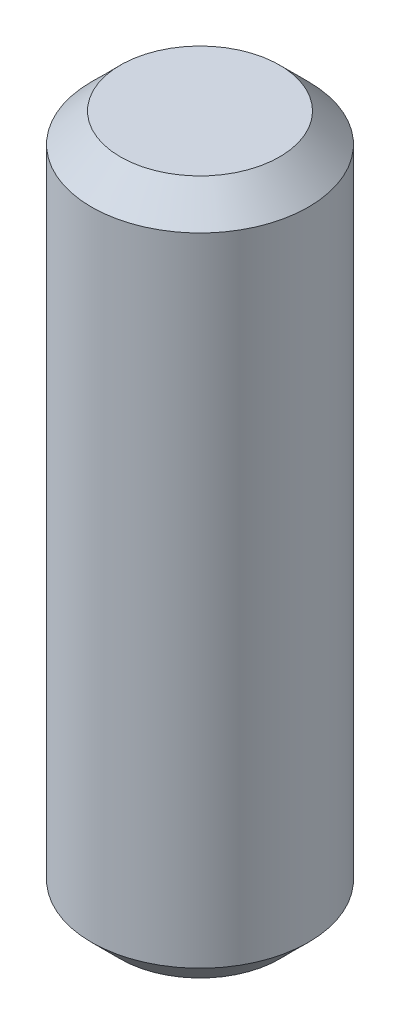
ISO-10303-21;
HEADER;
FILE_DESCRIPTION(('STEP AP214'),'2;1');
FILE_NAME('part.step','',(''),(''),'','','');
FILE_SCHEMA(('AUTOMOTIVE_DESIGN { 1 0 10303 214 1 1 1 1 }'));
ENDSEC;
DATA;
#1=APPLICATION_CONTEXT('core data for automotive mechanical design processes');
#2=APPLICATION_PROTOCOL_DEFINITION('international standard','automotive_design',2000,#1);
#3=PRODUCT_CONTEXT('',#1,'mechanical');
#4=PRODUCT('Part','Part','',(#3));
#5=PRODUCT_RELATED_PRODUCT_CATEGORY('part','',(#4));
#6=PRODUCT_DEFINITION_FORMATION('','',#4);
#7=PRODUCT_DEFINITION_CONTEXT('part definition',#1,'design');
#8=PRODUCT_DEFINITION('design','',#6,#7);
#9=PRODUCT_DEFINITION_SHAPE('','',#8);
#10=(LENGTH_UNIT() NAMED_UNIT(*) SI_UNIT(.MILLI.,.METRE.));
#11=(NAMED_UNIT(*) PLANE_ANGLE_UNIT() SI_UNIT($,.RADIAN.));
#12=(NAMED_UNIT(*) SI_UNIT($,.STERADIAN.) SOLID_ANGLE_UNIT());
#13=UNCERTAINTY_MEASURE_WITH_UNIT(LENGTH_MEASURE(1.E-05),#10,'distance_accuracy_value','');
#14=(GEOMETRIC_REPRESENTATION_CONTEXT(3) GLOBAL_UNCERTAINTY_ASSIGNED_CONTEXT((#13)) GLOBAL_UNIT_ASSIGNED_CONTEXT((#10,
#11,#12)) REPRESENTATION_CONTEXT('',''));
#15=CARTESIAN_POINT('',(0.,0.,0.));
#16=DIRECTION('',(0.,0.,1.));
#17=DIRECTION('',(1.,0.,0.));
#18=AXIS2_PLACEMENT_3D('',#15,#16,#17);
#19=CARTESIAN_POINT('',(0.,48.,0.));
#20=DIRECTION('',(0.,-1.,0.));
#21=DIRECTION('',(0.,0.,-1.));
#22=AXIS2_PLACEMENT_3D('',#19,#20,#21);
#23=CYLINDRICAL_SURFACE('',#22,7.5);
#24=CARTESIAN_POINT('',(0.,2.,0.));
#25=DIRECTION('',(0.,1.,0.));
#26=DIRECTION('',(0.,0.,1.));
#27=AXIS2_PLACEMENT_3D('',#24,#25,#26);
#28=CIRCLE('',#27,7.5);
#29=CARTESIAN_POINT('',(0.,2.,7.5));
#30=VERTEX_POINT('',#29);
#31=EDGE_CURVE('E53',#30,#30,#28,.T.);
#32=ORIENTED_EDGE('',*,*,#31,.T.);
#33=EDGE_LOOP('',(#32));
#34=FACE_BOUND('',#33,.T.);
#35=CARTESIAN_POINT('',(0.,46.,0.));
#36=DIRECTION('',(0.,1.,0.));
#37=DIRECTION('',(0.,0.,1.));
#38=AXIS2_PLACEMENT_3D('',#35,#36,#37);
#39=CIRCLE('',#38,7.5);
#40=CARTESIAN_POINT('',(0.,46.,7.5));
#41=VERTEX_POINT('',#40);
#42=EDGE_CURVE('E57',#41,#41,#39,.F.);
#43=ORIENTED_EDGE('',*,*,#42,.T.);
#44=EDGE_LOOP('',(#43));
#45=FACE_BOUND('',#44,.T.);
#46=ADVANCED_FACE('F41',(#34,#45),#23,.T.);
#47=CARTESIAN_POINT('',(0.,48.,0.));
#48=DIRECTION('',(0.,1.,0.));
#49=DIRECTION('',(0.,0.,1.));
#50=AXIS2_PLACEMENT_3D('',#47,#48,#49);
#51=PLANE('',#50);
#52=CARTESIAN_POINT('',(0.,48.,0.));
#53=DIRECTION('',(0.,1.,0.));
#54=DIRECTION('',(0.,0.,1.));
#55=AXIS2_PLACEMENT_3D('',#52,#53,#54);
#56=CIRCLE('',#55,5.49999999999999);
#57=CARTESIAN_POINT('',(0.,48.,5.49999999999999));
#58=VERTEX_POINT('',#57);
#59=EDGE_CURVE('E10',#58,#58,#56,.T.);
#60=ORIENTED_EDGE('',*,*,#59,.T.);
#61=EDGE_LOOP('',(#60));
#62=FACE_BOUND('',#61,.T.);
#63=ADVANCED_FACE('F73',(#62),#51,.T.);
#64=CARTESIAN_POINT('',(0.,0.,0.));
#65=DIRECTION('',(0.,1.,0.));
#66=DIRECTION('',(0.,0.,1.));
#67=AXIS2_PLACEMENT_3D('',#64,#65,#66);
#68=PLANE('',#67);
#69=CARTESIAN_POINT('',(0.,0.,0.));
#70=DIRECTION('',(0.,1.,0.));
#71=DIRECTION('',(0.,0.,1.));
#72=AXIS2_PLACEMENT_3D('',#69,#70,#71);
#73=CIRCLE('',#72,5.49999999999998);
#74=CARTESIAN_POINT('',(0.,0.,5.49999999999998));
#75=VERTEX_POINT('',#74);
#76=EDGE_CURVE('E49',#75,#75,#73,.F.);
#77=ORIENTED_EDGE('',*,*,#76,.T.);
#78=EDGE_LOOP('',(#77));
#79=FACE_BOUND('',#78,.T.);
#80=ADVANCED_FACE('F70',(#79),#68,.F.);
#81=CARTESIAN_POINT('',(0.,2.,0.));
#82=DIRECTION('',(0.,1.,0.));
#83=DIRECTION('',(0.,0.,1.));
#84=AXIS2_PLACEMENT_3D('',#81,#82,#83);
#85=CONICAL_SURFACE('',#84,7.5,0.785398163397451);
#86=ORIENTED_EDGE('',*,*,#76,.F.);
#87=EDGE_LOOP('',(#86));
#88=FACE_BOUND('',#87,.T.);
#89=ORIENTED_EDGE('',*,*,#31,.F.);
#90=EDGE_LOOP('',(#89));
#91=FACE_BOUND('',#90,.T.);
#92=ADVANCED_FACE('F66',(#88,#91),#85,.T.);
#93=CARTESIAN_POINT('',(0.,48.,0.));
#94=DIRECTION('',(0.,-1.,0.));
#95=DIRECTION('',(0.,0.,-1.));
#96=AXIS2_PLACEMENT_3D('',#93,#94,#95);
#97=CONICAL_SURFACE('',#96,5.49999999999999,0.785398163397447);
#98=ORIENTED_EDGE('',*,*,#42,.F.);
#99=EDGE_LOOP('',(#98));
#100=FACE_BOUND('',#99,.T.);
#101=ORIENTED_EDGE('',*,*,#59,.F.);
#102=EDGE_LOOP('',(#101));
#103=FACE_BOUND('',#102,.T.);
#104=ADVANCED_FACE('F44',(#100,#103),#97,.T.);
#105=CLOSED_SHELL('',(#46,#63,#80,#92,#104));
#106=MANIFOLD_SOLID_BREP('B2',#105);
#107=ADVANCED_BREP_SHAPE_REPRESENTATION('',(#18,#106),#14);
#108=SHAPE_DEFINITION_REPRESENTATION(#9,#107);
ENDSEC;
END-ISO-10303-21;
